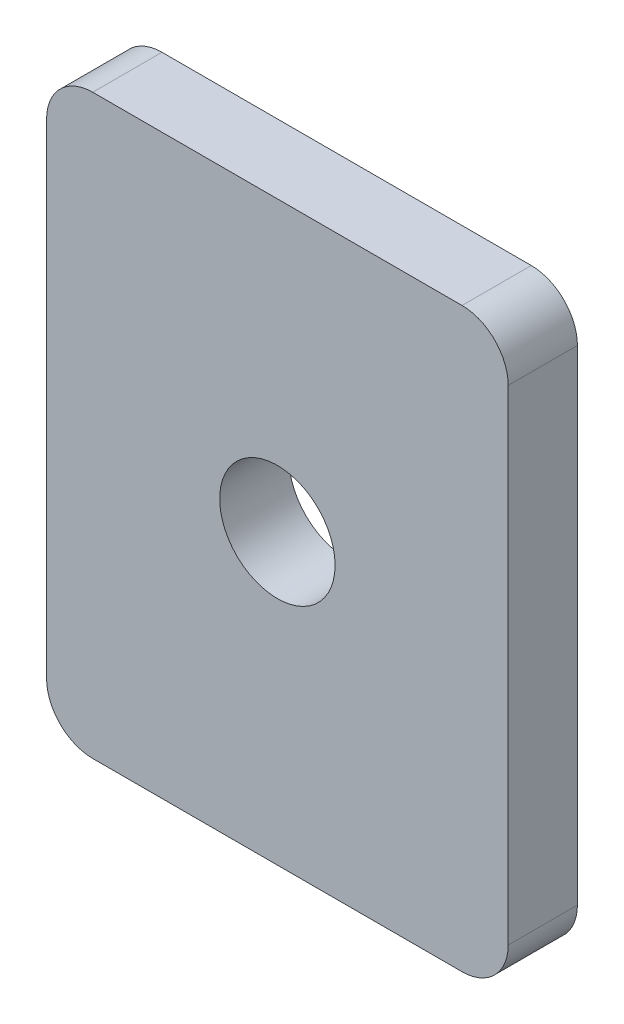
ISO-10303-21;
HEADER;
FILE_DESCRIPTION(('STEP AP214'),'2;1');
FILE_NAME('part.step','',(''),(''),'','','');
FILE_SCHEMA(('AUTOMOTIVE_DESIGN { 1 0 10303 214 1 1 1 1 }'));
ENDSEC;
DATA;
#1=APPLICATION_CONTEXT('core data for automotive mechanical design processes');
#2=APPLICATION_PROTOCOL_DEFINITION('international standard','automotive_design',2000,#1);
#3=PRODUCT_CONTEXT('',#1,'mechanical');
#4=PRODUCT('Part','Part','',(#3));
#5=PRODUCT_RELATED_PRODUCT_CATEGORY('part','',(#4));
#6=PRODUCT_DEFINITION_FORMATION('','',#4);
#7=PRODUCT_DEFINITION_CONTEXT('part definition',#1,'design');
#8=PRODUCT_DEFINITION('design','',#6,#7);
#9=PRODUCT_DEFINITION_SHAPE('','',#8);
#10=(LENGTH_UNIT() NAMED_UNIT(*) SI_UNIT(.MILLI.,.METRE.));
#11=(NAMED_UNIT(*) PLANE_ANGLE_UNIT() SI_UNIT($,.RADIAN.));
#12=(NAMED_UNIT(*) SI_UNIT($,.STERADIAN.) SOLID_ANGLE_UNIT());
#13=UNCERTAINTY_MEASURE_WITH_UNIT(LENGTH_MEASURE(1.E-05),#10,'distance_accuracy_value','');
#14=(GEOMETRIC_REPRESENTATION_CONTEXT(3) GLOBAL_UNCERTAINTY_ASSIGNED_CONTEXT((#13)) GLOBAL_UNIT_ASSIGNED_CONTEXT((#10,
#11,#12)) REPRESENTATION_CONTEXT('',''));
#15=CARTESIAN_POINT('',(0.,0.,0.));
#16=DIRECTION('',(0.,0.,1.));
#17=DIRECTION('',(1.,0.,0.));
#18=AXIS2_PLACEMENT_3D('',#15,#16,#17);
#19=CARTESIAN_POINT('',(0.,0.,3.));
#20=DIRECTION('',(0.,0.,1.));
#21=DIRECTION('',(1.,0.,0.));
#22=AXIS2_PLACEMENT_3D('',#19,#20,#21);
#23=PLANE('',#22);
#24=DIRECTION('',(0.,-1.,0.));
#25=VECTOR('',#24,1.);
#26=CARTESIAN_POINT('',(-10.,-12.5,3.));
#27=LINE('',#26,#25);
#28=CARTESIAN_POINT('',(-10.,10.5,3.));
#29=VERTEX_POINT('',#28);
#30=CARTESIAN_POINT('',(-10.,-10.5,3.));
#31=VERTEX_POINT('',#30);
#32=EDGE_CURVE('E137',#29,#31,#27,.T.);
#33=ORIENTED_EDGE('',*,*,#32,.T.);
#34=CARTESIAN_POINT('',(-8.,-10.5,3.));
#35=DIRECTION('',(0.,0.,1.));
#36=DIRECTION('',(1.,0.,0.));
#37=AXIS2_PLACEMENT_3D('',#34,#35,#36);
#38=CIRCLE('',#37,2.);
#39=CARTESIAN_POINT('',(-8.,-12.5,3.));
#40=VERTEX_POINT('',#39);
#41=EDGE_CURVE('E152',#31,#40,#38,.T.);
#42=ORIENTED_EDGE('',*,*,#41,.T.);
#43=DIRECTION('',(1.,0.,0.));
#44=VECTOR('',#43,1.);
#45=CARTESIAN_POINT('',(10.,-12.5,3.));
#46=LINE('',#45,#44);
#47=CARTESIAN_POINT('',(8.,-12.5,3.));
#48=VERTEX_POINT('',#47);
#49=EDGE_CURVE('E119',#40,#48,#46,.T.);
#50=ORIENTED_EDGE('',*,*,#49,.T.);
#51=CARTESIAN_POINT('',(8.,-10.5,3.));
#52=DIRECTION('',(0.,0.,1.));
#53=DIRECTION('',(1.,0.,0.));
#54=AXIS2_PLACEMENT_3D('',#51,#52,#53);
#55=CIRCLE('',#54,2.);
#56=CARTESIAN_POINT('',(10.,-10.5,3.));
#57=VERTEX_POINT('',#56);
#58=EDGE_CURVE('E150',#48,#57,#55,.T.);
#59=ORIENTED_EDGE('',*,*,#58,.T.);
#60=DIRECTION('',(0.,1.,0.));
#61=VECTOR('',#60,1.);
#62=CARTESIAN_POINT('',(10.,-12.5,3.));
#63=LINE('',#62,#61);
#64=CARTESIAN_POINT('',(10.,10.5,3.));
#65=VERTEX_POINT('',#64);
#66=EDGE_CURVE('E163',#57,#65,#63,.T.);
#67=ORIENTED_EDGE('',*,*,#66,.T.);
#68=CARTESIAN_POINT('',(8.,10.5,3.));
#69=DIRECTION('',(0.,0.,1.));
#70=DIRECTION('',(1.,0.,0.));
#71=AXIS2_PLACEMENT_3D('',#68,#69,#70);
#72=CIRCLE('',#71,2.);
#73=CARTESIAN_POINT('',(8.,12.5,3.));
#74=VERTEX_POINT('',#73);
#75=EDGE_CURVE('E54',#65,#74,#72,.T.);
#76=ORIENTED_EDGE('',*,*,#75,.T.);
#77=DIRECTION('',(-1.,0.,0.));
#78=VECTOR('',#77,1.);
#79=CARTESIAN_POINT('',(10.,12.5,3.));
#80=LINE('',#79,#78);
#81=CARTESIAN_POINT('',(-8.,12.5,3.));
#82=VERTEX_POINT('',#81);
#83=EDGE_CURVE('E138',#74,#82,#80,.T.);
#84=ORIENTED_EDGE('',*,*,#83,.T.);
#85=CARTESIAN_POINT('',(-8.,10.5,3.));
#86=DIRECTION('',(0.,0.,1.));
#87=DIRECTION('',(1.,0.,0.));
#88=AXIS2_PLACEMENT_3D('',#85,#86,#87);
#89=CIRCLE('',#88,2.);
#90=EDGE_CURVE('E147',#82,#29,#89,.T.);
#91=ORIENTED_EDGE('',*,*,#90,.T.);
#92=EDGE_LOOP('',(#33,#42,#50,#59,#67,#76,#84,#91));
#93=FACE_BOUND('',#92,.T.);
#94=CARTESIAN_POINT('',(0.,0.,3.));
#95=DIRECTION('',(0.,0.,1.));
#96=DIRECTION('',(1.,0.,0.));
#97=AXIS2_PLACEMENT_3D('',#94,#95,#96);
#98=CIRCLE('',#97,2.5);
#99=CARTESIAN_POINT('',(2.5,0.,3.));
#100=VERTEX_POINT('',#99);
#101=EDGE_CURVE('E132',#100,#100,#98,.T.);
#102=ORIENTED_EDGE('',*,*,#101,.F.);
#103=EDGE_LOOP('',(#102));
#104=FACE_BOUND('',#103,.T.);
#105=ADVANCED_FACE('F33',(#93,#104),#23,.T.);
#106=CARTESIAN_POINT('',(0.,0.,0.));
#107=DIRECTION('',(0.,0.,1.));
#108=DIRECTION('',(1.,0.,0.));
#109=AXIS2_PLACEMENT_3D('',#106,#107,#108);
#110=PLANE('',#109);
#111=DIRECTION('',(1.,0.,0.));
#112=VECTOR('',#111,1.);
#113=CARTESIAN_POINT('',(10.,-12.5,0.));
#114=LINE('',#113,#112);
#115=CARTESIAN_POINT('',(-8.,-12.5,0.));
#116=VERTEX_POINT('',#115);
#117=CARTESIAN_POINT('',(8.,-12.5,0.));
#118=VERTEX_POINT('',#117);
#119=EDGE_CURVE('E116',#116,#118,#114,.T.);
#120=ORIENTED_EDGE('',*,*,#119,.F.);
#121=CARTESIAN_POINT('',(-8.,-10.5,0.));
#122=DIRECTION('',(0.,0.,1.));
#123=DIRECTION('',(1.,0.,0.));
#124=AXIS2_PLACEMENT_3D('',#121,#122,#123);
#125=CIRCLE('',#124,2.);
#126=CARTESIAN_POINT('',(-10.,-10.5,0.));
#127=VERTEX_POINT('',#126);
#128=EDGE_CURVE('E99',#116,#127,#125,.F.);
#129=ORIENTED_EDGE('',*,*,#128,.T.);
#130=DIRECTION('',(0.,-1.,0.));
#131=VECTOR('',#130,1.);
#132=CARTESIAN_POINT('',(-10.,-12.5,0.));
#133=LINE('',#132,#131);
#134=CARTESIAN_POINT('',(-10.,10.5,0.));
#135=VERTEX_POINT('',#134);
#136=EDGE_CURVE('E127',#135,#127,#133,.T.);
#137=ORIENTED_EDGE('',*,*,#136,.F.);
#138=CARTESIAN_POINT('',(-8.,10.5,0.));
#139=DIRECTION('',(0.,0.,1.));
#140=DIRECTION('',(1.,0.,0.));
#141=AXIS2_PLACEMENT_3D('',#138,#139,#140);
#142=CIRCLE('',#141,2.);
#143=CARTESIAN_POINT('',(-8.,12.5,0.));
#144=VERTEX_POINT('',#143);
#145=EDGE_CURVE('E120',#135,#144,#142,.F.);
#146=ORIENTED_EDGE('',*,*,#145,.T.);
#147=DIRECTION('',(-1.,0.,0.));
#148=VECTOR('',#147,1.);
#149=CARTESIAN_POINT('',(10.,12.5,0.));
#150=LINE('',#149,#148);
#151=CARTESIAN_POINT('',(8.,12.5,0.));
#152=VERTEX_POINT('',#151);
#153=EDGE_CURVE('E130',#152,#144,#150,.T.);
#154=ORIENTED_EDGE('',*,*,#153,.F.);
#155=CARTESIAN_POINT('',(8.,10.5,0.));
#156=DIRECTION('',(0.,0.,1.));
#157=DIRECTION('',(1.,0.,0.));
#158=AXIS2_PLACEMENT_3D('',#155,#156,#157);
#159=CIRCLE('',#158,2.);
#160=CARTESIAN_POINT('',(10.,10.5,0.));
#161=VERTEX_POINT('',#160);
#162=EDGE_CURVE('E141',#152,#161,#159,.F.);
#163=ORIENTED_EDGE('',*,*,#162,.T.);
#164=DIRECTION('',(0.,1.,0.));
#165=VECTOR('',#164,1.);
#166=CARTESIAN_POINT('',(10.,-12.5,0.));
#167=LINE('',#166,#165);
#168=CARTESIAN_POINT('',(10.,-10.5,0.));
#169=VERTEX_POINT('',#168);
#170=EDGE_CURVE('E126',#169,#161,#167,.T.);
#171=ORIENTED_EDGE('',*,*,#170,.F.);
#172=CARTESIAN_POINT('',(8.,-10.5,0.));
#173=DIRECTION('',(0.,0.,1.));
#174=DIRECTION('',(1.,0.,0.));
#175=AXIS2_PLACEMENT_3D('',#172,#173,#174);
#176=CIRCLE('',#175,2.);
#177=EDGE_CURVE('E110',#169,#118,#176,.F.);
#178=ORIENTED_EDGE('',*,*,#177,.T.);
#179=EDGE_LOOP('',(#120,#129,#137,#146,#154,#163,#171,#178));
#180=FACE_BOUND('',#179,.T.);
#181=CARTESIAN_POINT('',(0.,0.,0.));
#182=DIRECTION('',(0.,0.,1.));
#183=DIRECTION('',(1.,0.,0.));
#184=AXIS2_PLACEMENT_3D('',#181,#182,#183);
#185=CIRCLE('',#184,2.5);
#186=CARTESIAN_POINT('',(2.5,0.,0.));
#187=VERTEX_POINT('',#186);
#188=EDGE_CURVE('E177',#187,#187,#185,.T.);
#189=ORIENTED_EDGE('',*,*,#188,.T.);
#190=EDGE_LOOP('',(#189));
#191=FACE_BOUND('',#190,.T.);
#192=ADVANCED_FACE('F123',(#180,#191),#110,.F.);
#193=CARTESIAN_POINT('',(-10.,-12.5,3.));
#194=DIRECTION('',(1.,0.,0.));
#195=DIRECTION('',(0.,0.,-1.));
#196=AXIS2_PLACEMENT_3D('',#193,#194,#195);
#197=PLANE('',#196);
#198=ORIENTED_EDGE('',*,*,#136,.T.);
#199=DIRECTION('',(0.,0.,-1.));
#200=VECTOR('',#199,1.);
#201=CARTESIAN_POINT('',(-10.,-10.5,3.));
#202=LINE('',#201,#200);
#203=EDGE_CURVE('E104',#127,#31,#202,.F.);
#204=ORIENTED_EDGE('',*,*,#203,.T.);
#205=ORIENTED_EDGE('',*,*,#32,.F.);
#206=DIRECTION('',(0.,0.,-1.));
#207=VECTOR('',#206,1.);
#208=CARTESIAN_POINT('',(-10.,10.5,3.));
#209=LINE('',#208,#207);
#210=EDGE_CURVE('E109',#29,#135,#209,.T.);
#211=ORIENTED_EDGE('',*,*,#210,.T.);
#212=EDGE_LOOP('',(#198,#204,#205,#211));
#213=FACE_BOUND('',#212,.T.);
#214=ADVANCED_FACE('F191',(#213),#197,.F.);
#215=CARTESIAN_POINT('',(10.,-12.5,3.));
#216=DIRECTION('',(0.,1.,0.));
#217=DIRECTION('',(-1.,0.,0.));
#218=AXIS2_PLACEMENT_3D('',#215,#216,#217);
#219=PLANE('',#218);
#220=ORIENTED_EDGE('',*,*,#49,.F.);
#221=DIRECTION('',(0.,0.,-1.));
#222=VECTOR('',#221,1.);
#223=CARTESIAN_POINT('',(-8.,-12.5,3.));
#224=LINE('',#223,#222);
#225=EDGE_CURVE('E103',#40,#116,#224,.T.);
#226=ORIENTED_EDGE('',*,*,#225,.T.);
#227=ORIENTED_EDGE('',*,*,#119,.T.);
#228=DIRECTION('',(0.,0.,-1.));
#229=VECTOR('',#228,1.);
#230=CARTESIAN_POINT('',(8.,-12.5,3.));
#231=LINE('',#230,#229);
#232=EDGE_CURVE('E121',#118,#48,#231,.F.);
#233=ORIENTED_EDGE('',*,*,#232,.T.);
#234=EDGE_LOOP('',(#220,#226,#227,#233));
#235=FACE_BOUND('',#234,.T.);
#236=ADVANCED_FACE('F115',(#235),#219,.F.);
#237=CARTESIAN_POINT('',(10.,-12.5,3.));
#238=DIRECTION('',(-1.,0.,0.));
#239=DIRECTION('',(0.,0.,1.));
#240=AXIS2_PLACEMENT_3D('',#237,#238,#239);
#241=PLANE('',#240);
#242=ORIENTED_EDGE('',*,*,#66,.F.);
#243=DIRECTION('',(0.,0.,-1.));
#244=VECTOR('',#243,1.);
#245=CARTESIAN_POINT('',(10.,-10.5,3.));
#246=LINE('',#245,#244);
#247=EDGE_CURVE('E156',#57,#169,#246,.T.);
#248=ORIENTED_EDGE('',*,*,#247,.T.);
#249=ORIENTED_EDGE('',*,*,#170,.T.);
#250=DIRECTION('',(0.,0.,-1.));
#251=VECTOR('',#250,1.);
#252=CARTESIAN_POINT('',(10.,10.5,3.));
#253=LINE('',#252,#251);
#254=EDGE_CURVE('E154',#161,#65,#253,.F.);
#255=ORIENTED_EDGE('',*,*,#254,.T.);
#256=EDGE_LOOP('',(#242,#248,#249,#255));
#257=FACE_BOUND('',#256,.T.);
#258=ADVANCED_FACE('F161',(#257),#241,.F.);
#259=CARTESIAN_POINT('',(10.,12.5,3.));
#260=DIRECTION('',(0.,-1.,0.));
#261=DIRECTION('',(1.,0.,0.));
#262=AXIS2_PLACEMENT_3D('',#259,#260,#261);
#263=PLANE('',#262);
#264=ORIENTED_EDGE('',*,*,#83,.F.);
#265=DIRECTION('',(0.,0.,-1.));
#266=VECTOR('',#265,1.);
#267=CARTESIAN_POINT('',(8.,12.5,3.));
#268=LINE('',#267,#266);
#269=EDGE_CURVE('E11',#74,#152,#268,.T.);
#270=ORIENTED_EDGE('',*,*,#269,.T.);
#271=ORIENTED_EDGE('',*,*,#153,.T.);
#272=DIRECTION('',(0.,0.,-1.));
#273=VECTOR('',#272,1.);
#274=CARTESIAN_POINT('',(-8.,12.5,3.));
#275=LINE('',#274,#273);
#276=EDGE_CURVE('E41',#144,#82,#275,.F.);
#277=ORIENTED_EDGE('',*,*,#276,.T.);
#278=EDGE_LOOP('',(#264,#270,#271,#277));
#279=FACE_BOUND('',#278,.T.);
#280=ADVANCED_FACE('F170',(#279),#263,.F.);
#281=CARTESIAN_POINT('',(0.,0.,3.));
#282=DIRECTION('',(0.,0.,-1.));
#283=DIRECTION('',(-1.,0.,0.));
#284=AXIS2_PLACEMENT_3D('',#281,#282,#283);
#285=CYLINDRICAL_SURFACE('',#284,2.5);
#286=ORIENTED_EDGE('',*,*,#101,.T.);
#287=EDGE_LOOP('',(#286));
#288=FACE_BOUND('',#287,.T.);
#289=ORIENTED_EDGE('',*,*,#188,.F.);
#290=EDGE_LOOP('',(#289));
#291=FACE_BOUND('',#290,.T.);
#292=ADVANCED_FACE('F183',(#288,#291),#285,.F.);
#293=CARTESIAN_POINT('',(-8.,-10.5,3.));
#294=DIRECTION('',(0.,0.,-1.));
#295=DIRECTION('',(-1.,0.,0.));
#296=AXIS2_PLACEMENT_3D('',#293,#294,#295);
#297=CYLINDRICAL_SURFACE('',#296,2.);
#298=ORIENTED_EDGE('',*,*,#41,.F.);
#299=ORIENTED_EDGE('',*,*,#203,.F.);
#300=ORIENTED_EDGE('',*,*,#128,.F.);
#301=ORIENTED_EDGE('',*,*,#225,.F.);
#302=EDGE_LOOP('',(#298,#299,#300,#301));
#303=FACE_BOUND('',#302,.T.);
#304=ADVANCED_FACE('F102',(#303),#297,.T.);
#305=CARTESIAN_POINT('',(8.,-10.5,3.));
#306=DIRECTION('',(0.,0.,-1.));
#307=DIRECTION('',(-1.,0.,0.));
#308=AXIS2_PLACEMENT_3D('',#305,#306,#307);
#309=CYLINDRICAL_SURFACE('',#308,2.);
#310=ORIENTED_EDGE('',*,*,#58,.F.);
#311=ORIENTED_EDGE('',*,*,#232,.F.);
#312=ORIENTED_EDGE('',*,*,#177,.F.);
#313=ORIENTED_EDGE('',*,*,#247,.F.);
#314=EDGE_LOOP('',(#310,#311,#312,#313));
#315=FACE_BOUND('',#314,.T.);
#316=ADVANCED_FACE('F206',(#315),#309,.T.);
#317=CARTESIAN_POINT('',(8.,10.5,3.));
#318=DIRECTION('',(0.,0.,-1.));
#319=DIRECTION('',(-1.,0.,0.));
#320=AXIS2_PLACEMENT_3D('',#317,#318,#319);
#321=CYLINDRICAL_SURFACE('',#320,2.);
#322=ORIENTED_EDGE('',*,*,#75,.F.);
#323=ORIENTED_EDGE('',*,*,#254,.F.);
#324=ORIENTED_EDGE('',*,*,#162,.F.);
#325=ORIENTED_EDGE('',*,*,#269,.F.);
#326=EDGE_LOOP('',(#322,#323,#324,#325));
#327=FACE_BOUND('',#326,.T.);
#328=ADVANCED_FACE('F169',(#327),#321,.T.);
#329=CARTESIAN_POINT('',(-8.,10.5,3.));
#330=DIRECTION('',(0.,0.,-1.));
#331=DIRECTION('',(-1.,0.,0.));
#332=AXIS2_PLACEMENT_3D('',#329,#330,#331);
#333=CYLINDRICAL_SURFACE('',#332,2.);
#334=ORIENTED_EDGE('',*,*,#90,.F.);
#335=ORIENTED_EDGE('',*,*,#276,.F.);
#336=ORIENTED_EDGE('',*,*,#145,.F.);
#337=ORIENTED_EDGE('',*,*,#210,.F.);
#338=EDGE_LOOP('',(#334,#335,#336,#337));
#339=FACE_BOUND('',#338,.T.);
#340=ADVANCED_FACE('F35',(#339),#333,.T.);
#341=CLOSED_SHELL('',(#105,#192,#214,#236,#258,#280,#292,#304,#316,#328,#340));
#342=MANIFOLD_SOLID_BREP('B2',#341);
#343=ADVANCED_BREP_SHAPE_REPRESENTATION('',(#18,#342),#14);
#344=SHAPE_DEFINITION_REPRESENTATION(#9,#343);
ENDSEC;
END-ISO-10303-21;
